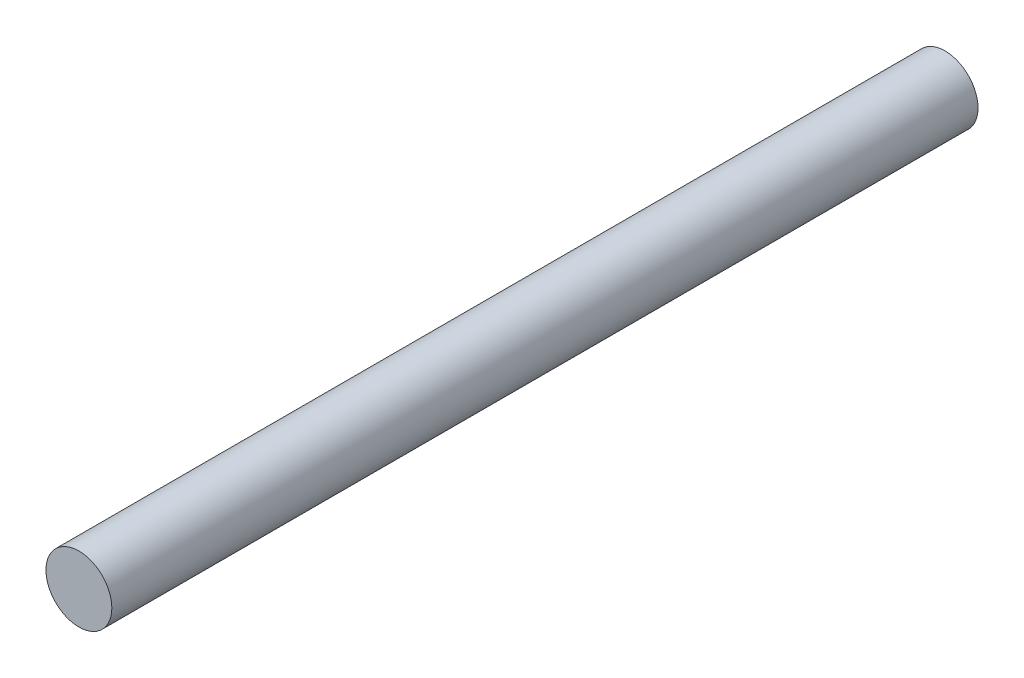
ISO-10303-21;
HEADER;
FILE_DESCRIPTION(('STEP AP214'),'2;1');
FILE_NAME('part.step','',(''),(''),'','','');
FILE_SCHEMA(('AUTOMOTIVE_DESIGN { 1 0 10303 214 1 1 1 1 }'));
ENDSEC;
DATA;
#1=APPLICATION_CONTEXT('core data for automotive mechanical design processes');
#2=APPLICATION_PROTOCOL_DEFINITION('international standard','automotive_design',2000,#1);
#3=PRODUCT_CONTEXT('',#1,'mechanical');
#4=PRODUCT('Part','Part','',(#3));
#5=PRODUCT_RELATED_PRODUCT_CATEGORY('part','',(#4));
#6=PRODUCT_DEFINITION_FORMATION('','',#4);
#7=PRODUCT_DEFINITION_CONTEXT('part definition',#1,'design');
#8=PRODUCT_DEFINITION('design','',#6,#7);
#9=PRODUCT_DEFINITION_SHAPE('','',#8);
#10=(LENGTH_UNIT() NAMED_UNIT(*) SI_UNIT(.MILLI.,.METRE.));
#11=(NAMED_UNIT(*) PLANE_ANGLE_UNIT() SI_UNIT($,.RADIAN.));
#12=(NAMED_UNIT(*) SI_UNIT($,.STERADIAN.) SOLID_ANGLE_UNIT());
#13=UNCERTAINTY_MEASURE_WITH_UNIT(LENGTH_MEASURE(1.E-05),#10,'distance_accuracy_value','');
#14=(GEOMETRIC_REPRESENTATION_CONTEXT(3) GLOBAL_UNCERTAINTY_ASSIGNED_CONTEXT((#13)) GLOBAL_UNIT_ASSIGNED_CONTEXT((#10,
#11,#12)) REPRESENTATION_CONTEXT('',''));
#15=CARTESIAN_POINT('',(0.,0.,0.));
#16=DIRECTION('',(0.,0.,1.));
#17=DIRECTION('',(1.,0.,0.));
#18=AXIS2_PLACEMENT_3D('',#15,#16,#17);
#19=CARTESIAN_POINT('',(0.,0.,46.));
#20=DIRECTION('',(0.,0.,-1.));
#21=DIRECTION('',(-1.,0.,0.));
#22=AXIS2_PLACEMENT_3D('',#19,#20,#21);
#23=CYLINDRICAL_SURFACE('',#22,1.75);
#24=CARTESIAN_POINT('',(0.,0.,46.));
#25=DIRECTION('',(0.,0.,1.));
#26=DIRECTION('',(1.,0.,0.));
#27=AXIS2_PLACEMENT_3D('',#24,#25,#26);
#28=CIRCLE('',#27,1.75);
#29=CARTESIAN_POINT('',(1.75,0.,46.));
#30=VERTEX_POINT('',#29);
#31=EDGE_CURVE('E10',#30,#30,#28,.T.);
#32=ORIENTED_EDGE('',*,*,#31,.F.);
#33=EDGE_LOOP('',(#32));
#34=FACE_BOUND('',#33,.T.);
#35=CARTESIAN_POINT('',(0.,0.,0.));
#36=DIRECTION('',(0.,0.,1.));
#37=DIRECTION('',(1.,0.,0.));
#38=AXIS2_PLACEMENT_3D('',#35,#36,#37);
#39=CIRCLE('',#38,1.75);
#40=CARTESIAN_POINT('',(1.75,0.,0.));
#41=VERTEX_POINT('',#40);
#42=EDGE_CURVE('E40',#41,#41,#39,.T.);
#43=ORIENTED_EDGE('',*,*,#42,.T.);
#44=EDGE_LOOP('',(#43));
#45=FACE_BOUND('',#44,.T.);
#46=ADVANCED_FACE('F37',(#34,#45),#23,.T.);
#47=CARTESIAN_POINT('',(0.,0.,46.));
#48=DIRECTION('',(0.,0.,1.));
#49=DIRECTION('',(1.,0.,0.));
#50=AXIS2_PLACEMENT_3D('',#47,#48,#49);
#51=PLANE('',#50);
#52=ORIENTED_EDGE('',*,*,#31,.T.);
#53=EDGE_LOOP('',(#52));
#54=FACE_BOUND('',#53,.T.);
#55=ADVANCED_FACE('F54',(#54),#51,.T.);
#56=CARTESIAN_POINT('',(0.,0.,0.));
#57=DIRECTION('',(0.,0.,1.));
#58=DIRECTION('',(1.,0.,0.));
#59=AXIS2_PLACEMENT_3D('',#56,#57,#58);
#60=PLANE('',#59);
#61=ORIENTED_EDGE('',*,*,#42,.F.);
#62=EDGE_LOOP('',(#61));
#63=FACE_BOUND('',#62,.T.);
#64=ADVANCED_FACE('F52',(#63),#60,.F.);
#65=CLOSED_SHELL('',(#46,#55,#64));
#66=MANIFOLD_SOLID_BREP('B2',#65);
#67=ADVANCED_BREP_SHAPE_REPRESENTATION('',(#18,#66),#14);
#68=SHAPE_DEFINITION_REPRESENTATION(#9,#67);
ENDSEC;
END-ISO-10303-21;
